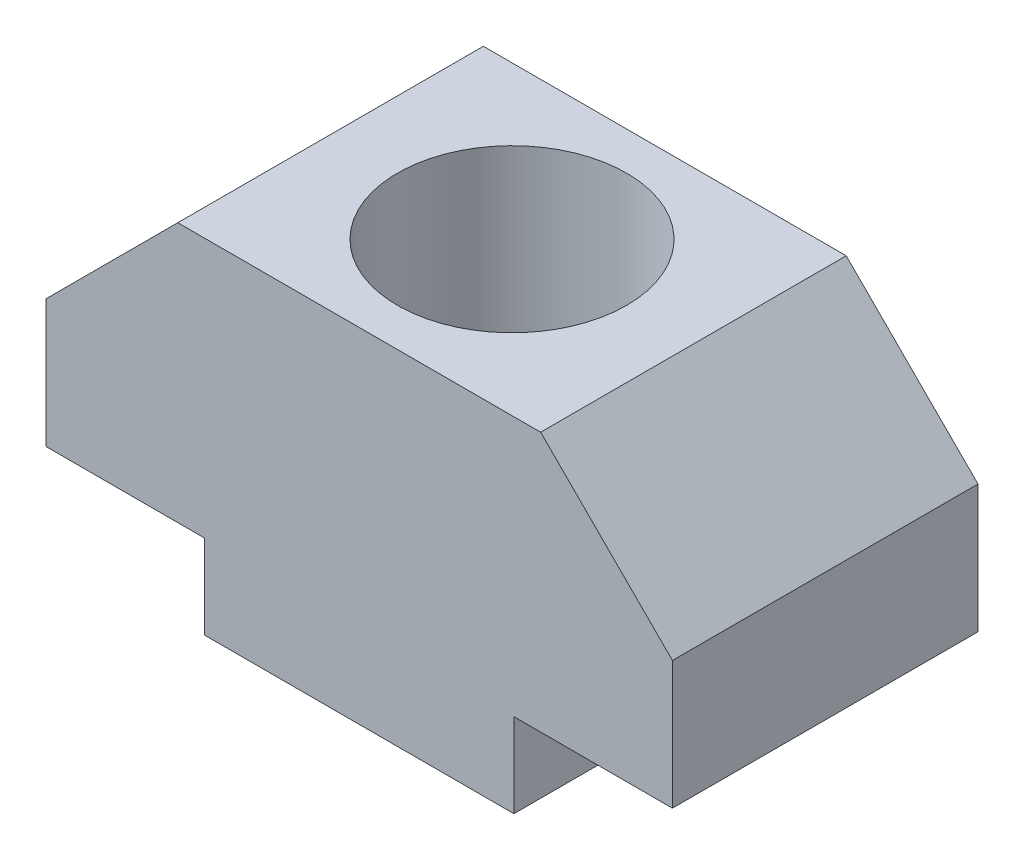
ISO-10303-21;
HEADER;
FILE_DESCRIPTION(('STEP AP214'),'2;1');
FILE_NAME('part.step','',(''),(''),'','','');
FILE_SCHEMA(('AUTOMOTIVE_DESIGN { 1 0 10303 214 1 1 1 1 }'));
ENDSEC;
DATA;
#1=APPLICATION_CONTEXT('core data for automotive mechanical design processes');
#2=APPLICATION_PROTOCOL_DEFINITION('international standard','automotive_design',2000,#1);
#3=PRODUCT_CONTEXT('',#1,'mechanical');
#4=PRODUCT('Part','Part','',(#3));
#5=PRODUCT_RELATED_PRODUCT_CATEGORY('part','',(#4));
#6=PRODUCT_DEFINITION_FORMATION('','',#4);
#7=PRODUCT_DEFINITION_CONTEXT('part definition',#1,'design');
#8=PRODUCT_DEFINITION('design','',#6,#7);
#9=PRODUCT_DEFINITION_SHAPE('','',#8);
#10=(LENGTH_UNIT() NAMED_UNIT(*) SI_UNIT(.MILLI.,.METRE.));
#11=(NAMED_UNIT(*) PLANE_ANGLE_UNIT() SI_UNIT($,.RADIAN.));
#12=(NAMED_UNIT(*) SI_UNIT($,.STERADIAN.) SOLID_ANGLE_UNIT());
#13=UNCERTAINTY_MEASURE_WITH_UNIT(LENGTH_MEASURE(1.E-05),#10,'distance_accuracy_value','');
#14=(GEOMETRIC_REPRESENTATION_CONTEXT(3) GLOBAL_UNCERTAINTY_ASSIGNED_CONTEXT((#13)) GLOBAL_UNIT_ASSIGNED_CONTEXT((#10,
#11,#12)) REPRESENTATION_CONTEXT('',''));
#15=CARTESIAN_POINT('',(0.,0.,0.));
#16=DIRECTION('',(0.,0.,1.));
#17=DIRECTION('',(1.,0.,0.));
#18=AXIS2_PLACEMENT_3D('',#15,#16,#17);
#19=CARTESIAN_POINT('',(4.75,9.,4.));
#20=DIRECTION('',(0.,-1.,0.));
#21=DIRECTION('',(1.,0.,0.));
#22=AXIS2_PLACEMENT_3D('',#19,#20,#21);
#23=PLANE('',#22);
#24=DIRECTION('',(-1.,0.,0.));
#25=VECTOR('',#24,1.);
#26=CARTESIAN_POINT('',(4.75,9.,-4.));
#27=LINE('',#26,#25);
#28=CARTESIAN_POINT('',(4.75,9.,-4.));
#29=VERTEX_POINT('',#28);
#30=CARTESIAN_POINT('',(-4.75,9.,-4.));
#31=VERTEX_POINT('',#30);
#32=EDGE_CURVE('E154',#29,#31,#27,.T.);
#33=ORIENTED_EDGE('',*,*,#32,.T.);
#34=DIRECTION('',(0.,0.,-1.));
#35=VECTOR('',#34,1.);
#36=CARTESIAN_POINT('',(-4.75,9.,4.));
#37=LINE('',#36,#35);
#38=CARTESIAN_POINT('',(-4.75,9.,4.));
#39=VERTEX_POINT('',#38);
#40=EDGE_CURVE('E170',#39,#31,#37,.T.);
#41=ORIENTED_EDGE('',*,*,#40,.F.);
#42=DIRECTION('',(-1.,0.,0.));
#43=VECTOR('',#42,1.);
#44=CARTESIAN_POINT('',(4.75,9.,4.));
#45=LINE('',#44,#43);
#46=CARTESIAN_POINT('',(4.75,9.,4.));
#47=VERTEX_POINT('',#46);
#48=EDGE_CURVE('E199',#47,#39,#45,.T.);
#49=ORIENTED_EDGE('',*,*,#48,.F.);
#50=DIRECTION('',(0.,0.,-1.));
#51=VECTOR('',#50,1.);
#52=CARTESIAN_POINT('',(4.75,9.,4.));
#53=LINE('',#52,#51);
#54=EDGE_CURVE('E173',#47,#29,#53,.T.);
#55=ORIENTED_EDGE('',*,*,#54,.T.);
#56=EDGE_LOOP('',(#33,#41,#49,#55));
#57=FACE_BOUND('',#56,.T.);
#58=CARTESIAN_POINT('',(0.,9.,0.));
#59=DIRECTION('',(0.,-1.,0.));
#60=DIRECTION('',(1.,0.,0.));
#61=AXIS2_PLACEMENT_3D('',#58,#59,#60);
#62=CIRCLE('',#61,3.);
#63=CARTESIAN_POINT('',(3.,9.,0.));
#64=VERTEX_POINT('',#63);
#65=EDGE_CURVE('E210',#64,#64,#62,.T.);
#66=ORIENTED_EDGE('',*,*,#65,.T.);
#67=EDGE_LOOP('',(#66));
#68=FACE_BOUND('',#67,.T.);
#69=ADVANCED_FACE('F35',(#57,#68),#23,.F.);
#70=CARTESIAN_POINT('',(-4.05,0.,4.));
#71=DIRECTION('',(0.,1.,0.));
#72=DIRECTION('',(-1.,0.,0.));
#73=AXIS2_PLACEMENT_3D('',#70,#71,#72);
#74=PLANE('',#73);
#75=DIRECTION('',(1.,0.,0.));
#76=VECTOR('',#75,1.);
#77=CARTESIAN_POINT('',(-4.05,0.,-4.));
#78=LINE('',#77,#76);
#79=CARTESIAN_POINT('',(-4.05,0.,-4.));
#80=VERTEX_POINT('',#79);
#81=CARTESIAN_POINT('',(4.05,0.,-4.));
#82=VERTEX_POINT('',#81);
#83=EDGE_CURVE('E93',#80,#82,#78,.T.);
#84=ORIENTED_EDGE('',*,*,#83,.T.);
#85=DIRECTION('',(0.,0.,-1.));
#86=VECTOR('',#85,1.);
#87=CARTESIAN_POINT('',(4.05,0.,4.));
#88=LINE('',#87,#86);
#89=CARTESIAN_POINT('',(4.05,0.,4.));
#90=VERTEX_POINT('',#89);
#91=EDGE_CURVE('E140',#90,#82,#88,.T.);
#92=ORIENTED_EDGE('',*,*,#91,.F.);
#93=DIRECTION('',(1.,0.,0.));
#94=VECTOR('',#93,1.);
#95=CARTESIAN_POINT('',(-4.05,0.,4.));
#96=LINE('',#95,#94);
#97=CARTESIAN_POINT('',(-4.05,0.,4.));
#98=VERTEX_POINT('',#97);
#99=EDGE_CURVE('E52',#98,#90,#96,.T.);
#100=ORIENTED_EDGE('',*,*,#99,.F.);
#101=DIRECTION('',(0.,0.,-1.));
#102=VECTOR('',#101,1.);
#103=CARTESIAN_POINT('',(-4.05,0.,4.));
#104=LINE('',#103,#102);
#105=EDGE_CURVE('E136',#98,#80,#104,.T.);
#106=ORIENTED_EDGE('',*,*,#105,.T.);
#107=EDGE_LOOP('',(#84,#92,#100,#106));
#108=FACE_BOUND('',#107,.T.);
#109=CARTESIAN_POINT('',(0.,0.,0.));
#110=DIRECTION('',(0.,1.,0.));
#111=DIRECTION('',(0.,0.,1.));
#112=AXIS2_PLACEMENT_3D('',#109,#110,#111);
#113=CIRCLE('',#112,3.);
#114=CARTESIAN_POINT('',(0.,0.,3.));
#115=VERTEX_POINT('',#114);
#116=EDGE_CURVE('E148',#115,#115,#113,.T.);
#117=ORIENTED_EDGE('',*,*,#116,.T.);
#118=EDGE_LOOP('',(#117));
#119=FACE_BOUND('',#118,.T.);
#120=ADVANCED_FACE('F216',(#108,#119),#74,.F.);
#121=CARTESIAN_POINT('',(4.05,0.,4.));
#122=DIRECTION('',(-1.,0.,0.));
#123=DIRECTION('',(0.,-1.,0.));
#124=AXIS2_PLACEMENT_3D('',#121,#122,#123);
#125=PLANE('',#124);
#126=DIRECTION('',(0.,1.,0.));
#127=VECTOR('',#126,1.);
#128=CARTESIAN_POINT('',(4.05,0.,-4.));
#129=LINE('',#128,#127);
#130=CARTESIAN_POINT('',(4.05,2.2,-4.));
#131=VERTEX_POINT('',#130);
#132=EDGE_CURVE('E144',#82,#131,#129,.T.);
#133=ORIENTED_EDGE('',*,*,#132,.T.);
#134=DIRECTION('',(0.,0.,-1.));
#135=VECTOR('',#134,1.);
#136=CARTESIAN_POINT('',(4.05,2.2,4.));
#137=LINE('',#136,#135);
#138=CARTESIAN_POINT('',(4.05,2.2,4.));
#139=VERTEX_POINT('',#138);
#140=EDGE_CURVE('E11',#139,#131,#137,.T.);
#141=ORIENTED_EDGE('',*,*,#140,.F.);
#142=DIRECTION('',(0.,1.,0.));
#143=VECTOR('',#142,1.);
#144=CARTESIAN_POINT('',(4.05,0.,4.));
#145=LINE('',#144,#143);
#146=EDGE_CURVE('E163',#90,#139,#145,.T.);
#147=ORIENTED_EDGE('',*,*,#146,.F.);
#148=ORIENTED_EDGE('',*,*,#91,.T.);
#149=EDGE_LOOP('',(#133,#141,#147,#148));
#150=FACE_BOUND('',#149,.T.);
#151=ADVANCED_FACE('F37',(#150),#125,.F.);
#152=CARTESIAN_POINT('',(4.05,2.2,4.));
#153=DIRECTION('',(0.,1.,0.));
#154=DIRECTION('',(-1.,0.,0.));
#155=AXIS2_PLACEMENT_3D('',#152,#153,#154);
#156=PLANE('',#155);
#157=DIRECTION('',(1.,0.,0.));
#158=VECTOR('',#157,1.);
#159=CARTESIAN_POINT('',(4.05,2.2,-4.));
#160=LINE('',#159,#158);
#161=CARTESIAN_POINT('',(8.2,2.2,-4.));
#162=VERTEX_POINT('',#161);
#163=EDGE_CURVE('E147',#131,#162,#160,.T.);
#164=ORIENTED_EDGE('',*,*,#163,.T.);
#165=DIRECTION('',(0.,0.,-1.));
#166=VECTOR('',#165,1.);
#167=CARTESIAN_POINT('',(8.2,2.2,4.));
#168=LINE('',#167,#166);
#169=CARTESIAN_POINT('',(8.2,2.2,4.));
#170=VERTEX_POINT('',#169);
#171=EDGE_CURVE('E44',#170,#162,#168,.T.);
#172=ORIENTED_EDGE('',*,*,#171,.F.);
#173=DIRECTION('',(1.,0.,0.));
#174=VECTOR('',#173,1.);
#175=CARTESIAN_POINT('',(4.05,2.2,4.));
#176=LINE('',#175,#174);
#177=EDGE_CURVE('E101',#139,#170,#176,.T.);
#178=ORIENTED_EDGE('',*,*,#177,.F.);
#179=ORIENTED_EDGE('',*,*,#140,.T.);
#180=EDGE_LOOP('',(#164,#172,#178,#179));
#181=FACE_BOUND('',#180,.T.);
#182=ADVANCED_FACE('F236',(#181),#156,.F.);
#183=CARTESIAN_POINT('',(8.2,2.2,4.));
#184=DIRECTION('',(-1.,0.,0.));
#185=DIRECTION('',(0.,-1.,0.));
#186=AXIS2_PLACEMENT_3D('',#183,#184,#185);
#187=PLANE('',#186);
#188=DIRECTION('',(0.,1.,0.));
#189=VECTOR('',#188,1.);
#190=CARTESIAN_POINT('',(8.2,2.2,-4.));
#191=LINE('',#190,#189);
#192=CARTESIAN_POINT('',(8.2,5.54999999999999,-4.));
#193=VERTEX_POINT('',#192);
#194=EDGE_CURVE('E150',#162,#193,#191,.T.);
#195=ORIENTED_EDGE('',*,*,#194,.T.);
#196=DIRECTION('',(0.,0.,-1.));
#197=VECTOR('',#196,1.);
#198=CARTESIAN_POINT('',(8.2,5.54999999999999,4.));
#199=LINE('',#198,#197);
#200=CARTESIAN_POINT('',(8.2,5.54999999999999,4.));
#201=VERTEX_POINT('',#200);
#202=EDGE_CURVE('E176',#201,#193,#199,.T.);
#203=ORIENTED_EDGE('',*,*,#202,.F.);
#204=DIRECTION('',(0.,1.,0.));
#205=VECTOR('',#204,1.);
#206=CARTESIAN_POINT('',(8.2,2.2,4.));
#207=LINE('',#206,#205);
#208=EDGE_CURVE('E184',#170,#201,#207,.T.);
#209=ORIENTED_EDGE('',*,*,#208,.F.);
#210=ORIENTED_EDGE('',*,*,#171,.T.);
#211=EDGE_LOOP('',(#195,#203,#209,#210));
#212=FACE_BOUND('',#211,.T.);
#213=ADVANCED_FACE('F182',(#212),#187,.F.);
#214=CARTESIAN_POINT('',(8.2,5.54999999999999,4.));
#215=DIRECTION('',(-0.707106781186549,-0.707106781186546,0.));
#216=DIRECTION('',(0.707106781186546,-0.707106781186549,0.));
#217=AXIS2_PLACEMENT_3D('',#214,#215,#216);
#218=PLANE('',#217);
#219=DIRECTION('',(-0.707106781186546,0.707106781186549,0.));
#220=VECTOR('',#219,1.);
#221=CARTESIAN_POINT('',(8.2,5.54999999999999,-4.));
#222=LINE('',#221,#220);
#223=EDGE_CURVE('E152',#193,#29,#222,.T.);
#224=ORIENTED_EDGE('',*,*,#223,.T.);
#225=ORIENTED_EDGE('',*,*,#54,.F.);
#226=DIRECTION('',(-0.707106781186546,0.707106781186549,0.));
#227=VECTOR('',#226,1.);
#228=CARTESIAN_POINT('',(8.2,5.54999999999999,4.));
#229=LINE('',#228,#227);
#230=EDGE_CURVE('E202',#201,#47,#229,.T.);
#231=ORIENTED_EDGE('',*,*,#230,.F.);
#232=ORIENTED_EDGE('',*,*,#202,.T.);
#233=EDGE_LOOP('',(#224,#225,#231,#232));
#234=FACE_BOUND('',#233,.T.);
#235=ADVANCED_FACE('F193',(#234),#218,.F.);
#236=CARTESIAN_POINT('',(-4.75,9.,4.));
#237=DIRECTION('',(0.707106781186549,-0.707106781186546,0.));
#238=DIRECTION('',(0.707106781186546,0.707106781186549,0.));
#239=AXIS2_PLACEMENT_3D('',#236,#237,#238);
#240=PLANE('',#239);
#241=DIRECTION('',(-0.707106781186546,-0.707106781186549,0.));
#242=VECTOR('',#241,1.);
#243=CARTESIAN_POINT('',(-4.75,9.,-4.));
#244=LINE('',#243,#242);
#245=CARTESIAN_POINT('',(-8.2,5.54999999999999,-4.));
#246=VERTEX_POINT('',#245);
#247=EDGE_CURVE('E156',#31,#246,#244,.T.);
#248=ORIENTED_EDGE('',*,*,#247,.T.);
#249=DIRECTION('',(0.,0.,-1.));
#250=VECTOR('',#249,1.);
#251=CARTESIAN_POINT('',(-8.2,5.54999999999999,4.));
#252=LINE('',#251,#250);
#253=CARTESIAN_POINT('',(-8.2,5.54999999999999,4.));
#254=VERTEX_POINT('',#253);
#255=EDGE_CURVE('E167',#254,#246,#252,.T.);
#256=ORIENTED_EDGE('',*,*,#255,.F.);
#257=DIRECTION('',(-0.707106781186546,-0.707106781186549,0.));
#258=VECTOR('',#257,1.);
#259=CARTESIAN_POINT('',(-4.75,9.,4.));
#260=LINE('',#259,#258);
#261=EDGE_CURVE('E201',#39,#254,#260,.T.);
#262=ORIENTED_EDGE('',*,*,#261,.F.);
#263=ORIENTED_EDGE('',*,*,#40,.T.);
#264=EDGE_LOOP('',(#248,#256,#262,#263));
#265=FACE_BOUND('',#264,.T.);
#266=ADVANCED_FACE('F231',(#265),#240,.F.);
#267=CARTESIAN_POINT('',(-8.2,5.54999999999999,4.));
#268=DIRECTION('',(1.,0.,0.));
#269=DIRECTION('',(0.,0.,-1.));
#270=AXIS2_PLACEMENT_3D('',#267,#268,#269);
#271=PLANE('',#270);
#272=DIRECTION('',(0.,-1.,0.));
#273=VECTOR('',#272,1.);
#274=CARTESIAN_POINT('',(-8.2,5.54999999999999,-4.));
#275=LINE('',#274,#273);
#276=CARTESIAN_POINT('',(-8.2,2.2,-4.));
#277=VERTEX_POINT('',#276);
#278=EDGE_CURVE('E158',#246,#277,#275,.T.);
#279=ORIENTED_EDGE('',*,*,#278,.T.);
#280=DIRECTION('',(0.,0.,-1.));
#281=VECTOR('',#280,1.);
#282=CARTESIAN_POINT('',(-8.2,2.2,4.));
#283=LINE('',#282,#281);
#284=CARTESIAN_POINT('',(-8.2,2.2,4.));
#285=VERTEX_POINT('',#284);
#286=EDGE_CURVE('E135',#285,#277,#283,.T.);
#287=ORIENTED_EDGE('',*,*,#286,.F.);
#288=DIRECTION('',(0.,-1.,0.));
#289=VECTOR('',#288,1.);
#290=CARTESIAN_POINT('',(-8.2,5.54999999999999,4.));
#291=LINE('',#290,#289);
#292=EDGE_CURVE('E126',#254,#285,#291,.T.);
#293=ORIENTED_EDGE('',*,*,#292,.F.);
#294=ORIENTED_EDGE('',*,*,#255,.T.);
#295=EDGE_LOOP('',(#279,#287,#293,#294));
#296=FACE_BOUND('',#295,.T.);
#297=ADVANCED_FACE('F246',(#296),#271,.F.);
#298=CARTESIAN_POINT('',(-8.2,2.2,4.));
#299=DIRECTION('',(0.,1.,0.));
#300=DIRECTION('',(0.,0.,1.));
#301=AXIS2_PLACEMENT_3D('',#298,#299,#300);
#302=PLANE('',#301);
#303=DIRECTION('',(1.,0.,0.));
#304=VECTOR('',#303,1.);
#305=CARTESIAN_POINT('',(-8.2,2.2,-4.));
#306=LINE('',#305,#304);
#307=CARTESIAN_POINT('',(-4.05,2.2,-4.));
#308=VERTEX_POINT('',#307);
#309=EDGE_CURVE('E134',#277,#308,#306,.T.);
#310=ORIENTED_EDGE('',*,*,#309,.T.);
#311=DIRECTION('',(0.,0.,-1.));
#312=VECTOR('',#311,1.);
#313=CARTESIAN_POINT('',(-4.05,2.2,4.));
#314=LINE('',#313,#312);
#315=CARTESIAN_POINT('',(-4.05,2.2,4.));
#316=VERTEX_POINT('',#315);
#317=EDGE_CURVE('E131',#316,#308,#314,.T.);
#318=ORIENTED_EDGE('',*,*,#317,.F.);
#319=DIRECTION('',(1.,0.,0.));
#320=VECTOR('',#319,1.);
#321=CARTESIAN_POINT('',(-8.2,2.2,4.));
#322=LINE('',#321,#320);
#323=EDGE_CURVE('E120',#285,#316,#322,.T.);
#324=ORIENTED_EDGE('',*,*,#323,.F.);
#325=ORIENTED_EDGE('',*,*,#286,.T.);
#326=EDGE_LOOP('',(#310,#318,#324,#325));
#327=FACE_BOUND('',#326,.T.);
#328=ADVANCED_FACE('F132',(#327),#302,.F.);
#329=CARTESIAN_POINT('',(-4.05,2.2,4.));
#330=DIRECTION('',(1.,0.,0.));
#331=DIRECTION('',(0.,1.,0.));
#332=AXIS2_PLACEMENT_3D('',#329,#330,#331);
#333=PLANE('',#332);
#334=DIRECTION('',(0.,-1.,0.));
#335=VECTOR('',#334,1.);
#336=CARTESIAN_POINT('',(-4.05,2.2,-4.));
#337=LINE('',#336,#335);
#338=EDGE_CURVE('E87',#308,#80,#337,.T.);
#339=ORIENTED_EDGE('',*,*,#338,.T.);
#340=ORIENTED_EDGE('',*,*,#105,.F.);
#341=DIRECTION('',(0.,-1.,0.));
#342=VECTOR('',#341,1.);
#343=CARTESIAN_POINT('',(-4.05,2.2,4.));
#344=LINE('',#343,#342);
#345=EDGE_CURVE('E124',#316,#98,#344,.T.);
#346=ORIENTED_EDGE('',*,*,#345,.F.);
#347=ORIENTED_EDGE('',*,*,#317,.T.);
#348=EDGE_LOOP('',(#339,#340,#346,#347));
#349=FACE_BOUND('',#348,.T.);
#350=ADVANCED_FACE('F138',(#349),#333,.F.);
#351=CARTESIAN_POINT('',(4.05,2.2,4.));
#352=DIRECTION('',(0.,0.,-1.));
#353=DIRECTION('',(-1.,0.,0.));
#354=AXIS2_PLACEMENT_3D('',#351,#352,#353);
#355=PLANE('',#354);
#356=ORIENTED_EDGE('',*,*,#146,.T.);
#357=ORIENTED_EDGE('',*,*,#177,.T.);
#358=ORIENTED_EDGE('',*,*,#208,.T.);
#359=ORIENTED_EDGE('',*,*,#230,.T.);
#360=ORIENTED_EDGE('',*,*,#48,.T.);
#361=ORIENTED_EDGE('',*,*,#261,.T.);
#362=ORIENTED_EDGE('',*,*,#292,.T.);
#363=ORIENTED_EDGE('',*,*,#323,.T.);
#364=ORIENTED_EDGE('',*,*,#345,.T.);
#365=ORIENTED_EDGE('',*,*,#99,.T.);
#366=EDGE_LOOP('',(#356,#357,#358,#359,#360,#361,#362,#363,#364,#365));
#367=FACE_BOUND('',#366,.T.);
#368=ADVANCED_FACE('F122',(#367),#355,.F.);
#369=CARTESIAN_POINT('',(4.05,2.2,-4.));
#370=DIRECTION('',(0.,0.,-1.));
#371=DIRECTION('',(-1.,0.,0.));
#372=AXIS2_PLACEMENT_3D('',#369,#370,#371);
#373=PLANE('',#372);
#374=ORIENTED_EDGE('',*,*,#132,.F.);
#375=ORIENTED_EDGE('',*,*,#83,.F.);
#376=ORIENTED_EDGE('',*,*,#338,.F.);
#377=ORIENTED_EDGE('',*,*,#309,.F.);
#378=ORIENTED_EDGE('',*,*,#278,.F.);
#379=ORIENTED_EDGE('',*,*,#247,.F.);
#380=ORIENTED_EDGE('',*,*,#32,.F.);
#381=ORIENTED_EDGE('',*,*,#223,.F.);
#382=ORIENTED_EDGE('',*,*,#194,.F.);
#383=ORIENTED_EDGE('',*,*,#163,.F.);
#384=EDGE_LOOP('',(#374,#375,#376,#377,#378,#379,#380,#381,#382,#383));
#385=FACE_BOUND('',#384,.T.);
#386=ADVANCED_FACE('F188',(#385),#373,.T.);
#387=CARTESIAN_POINT('',(0.,9.001,0.));
#388=DIRECTION('',(0.,-1.,0.));
#389=DIRECTION('',(0.,0.,-1.));
#390=AXIS2_PLACEMENT_3D('',#387,#388,#389);
#391=CYLINDRICAL_SURFACE('',#390,3.);
#392=ORIENTED_EDGE('',*,*,#116,.F.);
#393=EDGE_LOOP('',(#392));
#394=FACE_BOUND('',#393,.T.);
#395=ORIENTED_EDGE('',*,*,#65,.F.);
#396=EDGE_LOOP('',(#395));
#397=FACE_BOUND('',#396,.T.);
#398=ADVANCED_FACE('F218',(#394,#397),#391,.F.);
#399=CLOSED_SHELL('',(#69,#120,#151,#182,#213,#235,#266,#297,#328,#350,#368,#386,#398));
#400=MANIFOLD_SOLID_BREP('B2',#399);
#401=ADVANCED_BREP_SHAPE_REPRESENTATION('',(#18,#400),#14);
#402=SHAPE_DEFINITION_REPRESENTATION(#9,#401);
ENDSEC;
END-ISO-10303-21;
